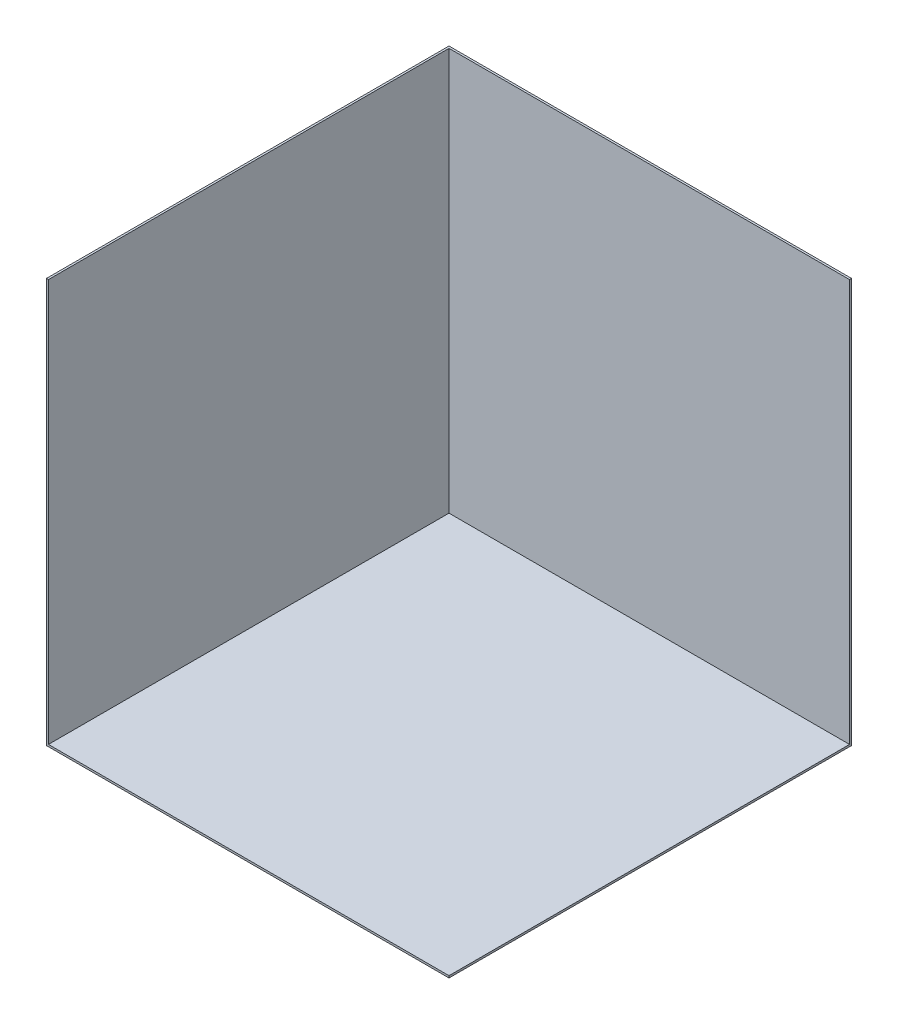
ISO-10303-21;
HEADER;
FILE_DESCRIPTION(('STEP AP214'),'2;1');
FILE_NAME('part.step','',(''),(''),'','','');
FILE_SCHEMA(('AUTOMOTIVE_DESIGN { 1 0 10303 214 1 1 1 1 }'));
ENDSEC;
DATA;
#1=APPLICATION_CONTEXT('core data for automotive mechanical design processes');
#2=APPLICATION_PROTOCOL_DEFINITION('international standard','automotive_design',2000,#1);
#3=PRODUCT_CONTEXT('',#1,'mechanical');
#4=PRODUCT('Part','Part','',(#3));
#5=PRODUCT_RELATED_PRODUCT_CATEGORY('part','',(#4));
#6=PRODUCT_DEFINITION_FORMATION('','',#4);
#7=PRODUCT_DEFINITION_CONTEXT('part definition',#1,'design');
#8=PRODUCT_DEFINITION('design','',#6,#7);
#9=PRODUCT_DEFINITION_SHAPE('','',#8);
#10=(LENGTH_UNIT() NAMED_UNIT(*) SI_UNIT(.MILLI.,.METRE.));
#11=(NAMED_UNIT(*) PLANE_ANGLE_UNIT() SI_UNIT($,.RADIAN.));
#12=(NAMED_UNIT(*) SI_UNIT($,.STERADIAN.) SOLID_ANGLE_UNIT());
#13=UNCERTAINTY_MEASURE_WITH_UNIT(LENGTH_MEASURE(1.E-05),#10,'distance_accuracy_value','');
#14=(GEOMETRIC_REPRESENTATION_CONTEXT(3) GLOBAL_UNCERTAINTY_ASSIGNED_CONTEXT((#13)) GLOBAL_UNIT_ASSIGNED_CONTEXT((#10,
#11,#12)) REPRESENTATION_CONTEXT('',''));
#15=CARTESIAN_POINT('',(0.,0.,0.));
#16=DIRECTION('',(0.,0.,1.));
#17=DIRECTION('',(1.,0.,0.));
#18=AXIS2_PLACEMENT_3D('',#15,#16,#17);
#19=CARTESIAN_POINT('',(0.,10.,0.));
#20=DIRECTION('',(0.,1.,0.));
#21=DIRECTION('',(0.,0.,1.));
#22=AXIS2_PLACEMENT_3D('',#19,#20,#21);
#23=PLANE('',#22);
#24=DIRECTION('',(0.,0.,-1.));
#25=VECTOR('',#24,1.);
#26=CARTESIAN_POINT('',(0.,10.,-2000.));
#27=LINE('',#26,#25);
#28=CARTESIAN_POINT('',(0.,10.,0.));
#29=VERTEX_POINT('',#28);
#30=CARTESIAN_POINT('',(0.,10.,-1990.));
#31=VERTEX_POINT('',#30);
#32=EDGE_CURVE('E103',#29,#31,#27,.T.);
#33=ORIENTED_EDGE('',*,*,#32,.T.);
#34=DIRECTION('',(-1.,0.,0.));
#35=VECTOR('',#34,1.);
#36=CARTESIAN_POINT('',(-2.20934381900406E-13,10.,-1990.));
#37=LINE('',#36,#35);
#38=CARTESIAN_POINT('',(-1990.,10.,-1990.));
#39=VERTEX_POINT('',#38);
#40=EDGE_CURVE('E248',#31,#39,#37,.T.);
#41=ORIENTED_EDGE('',*,*,#40,.T.);
#42=DIRECTION('',(0.,0.,1.));
#43=VECTOR('',#42,1.);
#44=CARTESIAN_POINT('',(-1990.,10.,2.20934381900406E-13));
#45=LINE('',#44,#43);
#46=CARTESIAN_POINT('',(-1990.,10.,0.));
#47=VERTEX_POINT('',#46);
#48=EDGE_CURVE('E245',#39,#47,#45,.T.);
#49=ORIENTED_EDGE('',*,*,#48,.T.);
#50=DIRECTION('',(1.,0.,0.));
#51=VECTOR('',#50,1.);
#52=CARTESIAN_POINT('',(-2000.,10.,0.));
#53=LINE('',#52,#51);
#54=EDGE_CURVE('E58',#47,#29,#53,.T.);
#55=ORIENTED_EDGE('',*,*,#54,.T.);
#56=EDGE_LOOP('',(#33,#41,#49,#55));
#57=FACE_BOUND('',#56,.T.);
#58=ADVANCED_FACE('F35',(#57),#23,.T.);
#59=CARTESIAN_POINT('',(0.,10.,-2000.));
#60=DIRECTION('',(-1.,0.,0.));
#61=DIRECTION('',(0.,0.,1.));
#62=AXIS2_PLACEMENT_3D('',#59,#60,#61);
#63=PLANE('',#62);
#64=DIRECTION('',(0.,0.,-1.));
#65=VECTOR('',#64,1.);
#66=CARTESIAN_POINT('',(0.,0.,-2000.));
#67=LINE('',#66,#65);
#68=CARTESIAN_POINT('',(0.,0.,0.));
#69=VERTEX_POINT('',#68);
#70=CARTESIAN_POINT('',(0.,0.,-2000.));
#71=VERTEX_POINT('',#70);
#72=EDGE_CURVE('E102',#69,#71,#67,.T.);
#73=ORIENTED_EDGE('',*,*,#72,.T.);
#74=DIRECTION('',(0.,-1.,0.));
#75=VECTOR('',#74,1.);
#76=CARTESIAN_POINT('',(0.,10.,-2000.));
#77=LINE('',#76,#75);
#78=CARTESIAN_POINT('',(0.,2010.,-2000.));
#79=VERTEX_POINT('',#78);
#80=EDGE_CURVE('E11',#79,#71,#77,.T.);
#81=ORIENTED_EDGE('',*,*,#80,.F.);
#82=DIRECTION('',(0.,0.,-1.));
#83=VECTOR('',#82,1.);
#84=CARTESIAN_POINT('',(0.,2010.,0.));
#85=LINE('',#84,#83);
#86=CARTESIAN_POINT('',(0.,2010.,-1990.));
#87=VERTEX_POINT('',#86);
#88=EDGE_CURVE('E240',#87,#79,#85,.T.);
#89=ORIENTED_EDGE('',*,*,#88,.F.);
#90=DIRECTION('',(0.,-1.,0.));
#91=VECTOR('',#90,1.);
#92=CARTESIAN_POINT('',(0.,2010.,-1990.));
#93=LINE('',#92,#91);
#94=EDGE_CURVE('E113',#87,#31,#93,.T.);
#95=ORIENTED_EDGE('',*,*,#94,.T.);
#96=ORIENTED_EDGE('',*,*,#32,.F.);
#97=DIRECTION('',(0.,-1.,0.));
#98=VECTOR('',#97,1.);
#99=CARTESIAN_POINT('',(0.,10.,0.));
#100=LINE('',#99,#98);
#101=EDGE_CURVE('E97',#29,#69,#100,.T.);
#102=ORIENTED_EDGE('',*,*,#101,.T.);
#103=EDGE_LOOP('',(#73,#81,#89,#95,#96,#102));
#104=FACE_BOUND('',#103,.T.);
#105=ADVANCED_FACE('F37',(#104),#63,.F.);
#106=CARTESIAN_POINT('',(-2000.,10.,-2000.));
#107=DIRECTION('',(0.,0.,1.));
#108=DIRECTION('',(1.,0.,0.));
#109=AXIS2_PLACEMENT_3D('',#106,#107,#108);
#110=PLANE('',#109);
#111=DIRECTION('',(-1.,0.,0.));
#112=VECTOR('',#111,1.);
#113=CARTESIAN_POINT('',(-2000.,0.,-2000.));
#114=LINE('',#113,#112);
#115=CARTESIAN_POINT('',(-2000.,0.,-2000.));
#116=VERTEX_POINT('',#115);
#117=EDGE_CURVE('E89',#71,#116,#114,.T.);
#118=ORIENTED_EDGE('',*,*,#117,.T.);
#119=DIRECTION('',(0.,-1.,0.));
#120=VECTOR('',#119,1.);
#121=CARTESIAN_POINT('',(-2000.,10.,-2000.));
#122=LINE('',#121,#120);
#123=CARTESIAN_POINT('',(-2000.,2010.,-2000.));
#124=VERTEX_POINT('',#123);
#125=EDGE_CURVE('E43',#124,#116,#122,.T.);
#126=ORIENTED_EDGE('',*,*,#125,.F.);
#127=DIRECTION('',(-1.,0.,0.));
#128=VECTOR('',#127,1.);
#129=CARTESIAN_POINT('',(0.,2010.,-2000.));
#130=LINE('',#129,#128);
#131=EDGE_CURVE('E121',#79,#124,#130,.T.);
#132=ORIENTED_EDGE('',*,*,#131,.F.);
#133=ORIENTED_EDGE('',*,*,#80,.T.);
#134=EDGE_LOOP('',(#118,#126,#132,#133));
#135=FACE_BOUND('',#134,.T.);
#136=ADVANCED_FACE('F115',(#135),#110,.F.);
#137=CARTESIAN_POINT('',(-2000.,10.,-2000.));
#138=DIRECTION('',(1.,0.,0.));
#139=DIRECTION('',(0.,0.,-1.));
#140=AXIS2_PLACEMENT_3D('',#137,#138,#139);
#141=PLANE('',#140);
#142=DIRECTION('',(0.,0.,1.));
#143=VECTOR('',#142,1.);
#144=CARTESIAN_POINT('',(-2000.,0.,-2000.));
#145=LINE('',#144,#143);
#146=CARTESIAN_POINT('',(-2000.,0.,0.));
#147=VERTEX_POINT('',#146);
#148=EDGE_CURVE('E78',#116,#147,#145,.T.);
#149=ORIENTED_EDGE('',*,*,#148,.T.);
#150=DIRECTION('',(0.,-1.,0.));
#151=VECTOR('',#150,1.);
#152=CARTESIAN_POINT('',(-2000.,10.,0.));
#153=LINE('',#152,#151);
#154=CARTESIAN_POINT('',(-2000.,2010.,0.));
#155=VERTEX_POINT('',#154);
#156=EDGE_CURVE('E83',#155,#147,#153,.T.);
#157=ORIENTED_EDGE('',*,*,#156,.F.);
#158=DIRECTION('',(0.,0.,1.));
#159=VECTOR('',#158,1.);
#160=CARTESIAN_POINT('',(-2000.,2010.,2.22044604925031E-13));
#161=LINE('',#160,#159);
#162=EDGE_CURVE('E252',#124,#155,#161,.T.);
#163=ORIENTED_EDGE('',*,*,#162,.F.);
#164=ORIENTED_EDGE('',*,*,#125,.T.);
#165=EDGE_LOOP('',(#149,#157,#163,#164));
#166=FACE_BOUND('',#165,.T.);
#167=ADVANCED_FACE('F80',(#166),#141,.F.);
#168=CARTESIAN_POINT('',(-2000.,10.,0.));
#169=DIRECTION('',(0.,0.,-1.));
#170=DIRECTION('',(-1.,0.,0.));
#171=AXIS2_PLACEMENT_3D('',#168,#169,#170);
#172=PLANE('',#171);
#173=DIRECTION('',(1.,0.,0.));
#174=VECTOR('',#173,1.);
#175=CARTESIAN_POINT('',(-2000.,0.,0.));
#176=LINE('',#175,#174);
#177=EDGE_CURVE('E88',#147,#69,#176,.T.);
#178=ORIENTED_EDGE('',*,*,#177,.T.);
#179=ORIENTED_EDGE('',*,*,#101,.F.);
#180=ORIENTED_EDGE('',*,*,#54,.F.);
#181=DIRECTION('',(0.,-1.,0.));
#182=VECTOR('',#181,1.);
#183=CARTESIAN_POINT('',(-1990.,2010.,0.));
#184=LINE('',#183,#182);
#185=CARTESIAN_POINT('',(-1990.,2010.,0.));
#186=VERTEX_POINT('',#185);
#187=EDGE_CURVE('E50',#186,#47,#184,.T.);
#188=ORIENTED_EDGE('',*,*,#187,.F.);
#189=DIRECTION('',(1.,0.,0.));
#190=VECTOR('',#189,1.);
#191=CARTESIAN_POINT('',(0.,2010.,0.));
#192=LINE('',#191,#190);
#193=EDGE_CURVE('E96',#155,#186,#192,.T.);
#194=ORIENTED_EDGE('',*,*,#193,.F.);
#195=ORIENTED_EDGE('',*,*,#156,.T.);
#196=EDGE_LOOP('',(#178,#179,#180,#188,#194,#195));
#197=FACE_BOUND('',#196,.T.);
#198=ADVANCED_FACE('F93',(#197),#172,.F.);
#199=CARTESIAN_POINT('',(0.,0.,0.));
#200=DIRECTION('',(0.,1.,0.));
#201=DIRECTION('',(0.,0.,1.));
#202=AXIS2_PLACEMENT_3D('',#199,#200,#201);
#203=PLANE('',#202);
#204=ORIENTED_EDGE('',*,*,#72,.F.);
#205=ORIENTED_EDGE('',*,*,#177,.F.);
#206=ORIENTED_EDGE('',*,*,#148,.F.);
#207=ORIENTED_EDGE('',*,*,#117,.F.);
#208=EDGE_LOOP('',(#204,#205,#206,#207));
#209=FACE_BOUND('',#208,.T.);
#210=ADVANCED_FACE('F100',(#209),#203,.F.);
#211=CARTESIAN_POINT('',(-2.20934381900406E-13,2010.,-1990.));
#212=DIRECTION('',(0.,0.,1.));
#213=DIRECTION('',(1.,0.,0.));
#214=AXIS2_PLACEMENT_3D('',#211,#212,#213);
#215=PLANE('',#214);
#216=ORIENTED_EDGE('',*,*,#40,.F.);
#217=ORIENTED_EDGE('',*,*,#94,.F.);
#218=DIRECTION('',(-1.,0.,0.));
#219=VECTOR('',#218,1.);
#220=CARTESIAN_POINT('',(-2.20934381900406E-13,2010.,-1990.));
#221=LINE('',#220,#219);
#222=CARTESIAN_POINT('',(-1990.,2010.,-1990.));
#223=VERTEX_POINT('',#222);
#224=EDGE_CURVE('E239',#87,#223,#221,.T.);
#225=ORIENTED_EDGE('',*,*,#224,.T.);
#226=DIRECTION('',(0.,-1.,0.));
#227=VECTOR('',#226,1.);
#228=CARTESIAN_POINT('',(-1990.,2010.,-1990.));
#229=LINE('',#228,#227);
#230=EDGE_CURVE('E256',#223,#39,#229,.T.);
#231=ORIENTED_EDGE('',*,*,#230,.T.);
#232=EDGE_LOOP('',(#216,#217,#225,#231));
#233=FACE_BOUND('',#232,.T.);
#234=ADVANCED_FACE('F134',(#233),#215,.T.);
#235=CARTESIAN_POINT('',(-1990.,2010.,2.20934381900406E-13));
#236=DIRECTION('',(1.,0.,0.));
#237=DIRECTION('',(0.,0.,-1.));
#238=AXIS2_PLACEMENT_3D('',#235,#236,#237);
#239=PLANE('',#238);
#240=ORIENTED_EDGE('',*,*,#48,.F.);
#241=ORIENTED_EDGE('',*,*,#230,.F.);
#242=DIRECTION('',(0.,0.,1.));
#243=VECTOR('',#242,1.);
#244=CARTESIAN_POINT('',(-1990.,2010.,2.20934381900406E-13));
#245=LINE('',#244,#243);
#246=EDGE_CURVE('E241',#223,#186,#245,.T.);
#247=ORIENTED_EDGE('',*,*,#246,.T.);
#248=ORIENTED_EDGE('',*,*,#187,.T.);
#249=EDGE_LOOP('',(#240,#241,#247,#248));
#250=FACE_BOUND('',#249,.T.);
#251=ADVANCED_FACE('F159',(#250),#239,.T.);
#252=CARTESIAN_POINT('',(0.,2010.,0.));
#253=DIRECTION('',(0.,1.,0.));
#254=DIRECTION('',(0.,0.,1.));
#255=AXIS2_PLACEMENT_3D('',#252,#253,#254);
#256=PLANE('',#255);
#257=ORIENTED_EDGE('',*,*,#224,.F.);
#258=ORIENTED_EDGE('',*,*,#88,.T.);
#259=ORIENTED_EDGE('',*,*,#131,.T.);
#260=ORIENTED_EDGE('',*,*,#162,.T.);
#261=ORIENTED_EDGE('',*,*,#193,.T.);
#262=ORIENTED_EDGE('',*,*,#246,.F.);
#263=EDGE_LOOP('',(#257,#258,#259,#260,#261,#262));
#264=FACE_BOUND('',#263,.T.);
#265=ADVANCED_FACE('F166',(#264),#256,.T.);
#266=CLOSED_SHELL('',(#58,#105,#136,#167,#198,#210,#234,#251,#265));
#267=MANIFOLD_SOLID_BREP('B2',#266);
#268=ADVANCED_BREP_SHAPE_REPRESENTATION('',(#18,#267),#14);
#269=SHAPE_DEFINITION_REPRESENTATION(#9,#268);
ENDSEC;
END-ISO-10303-21;
